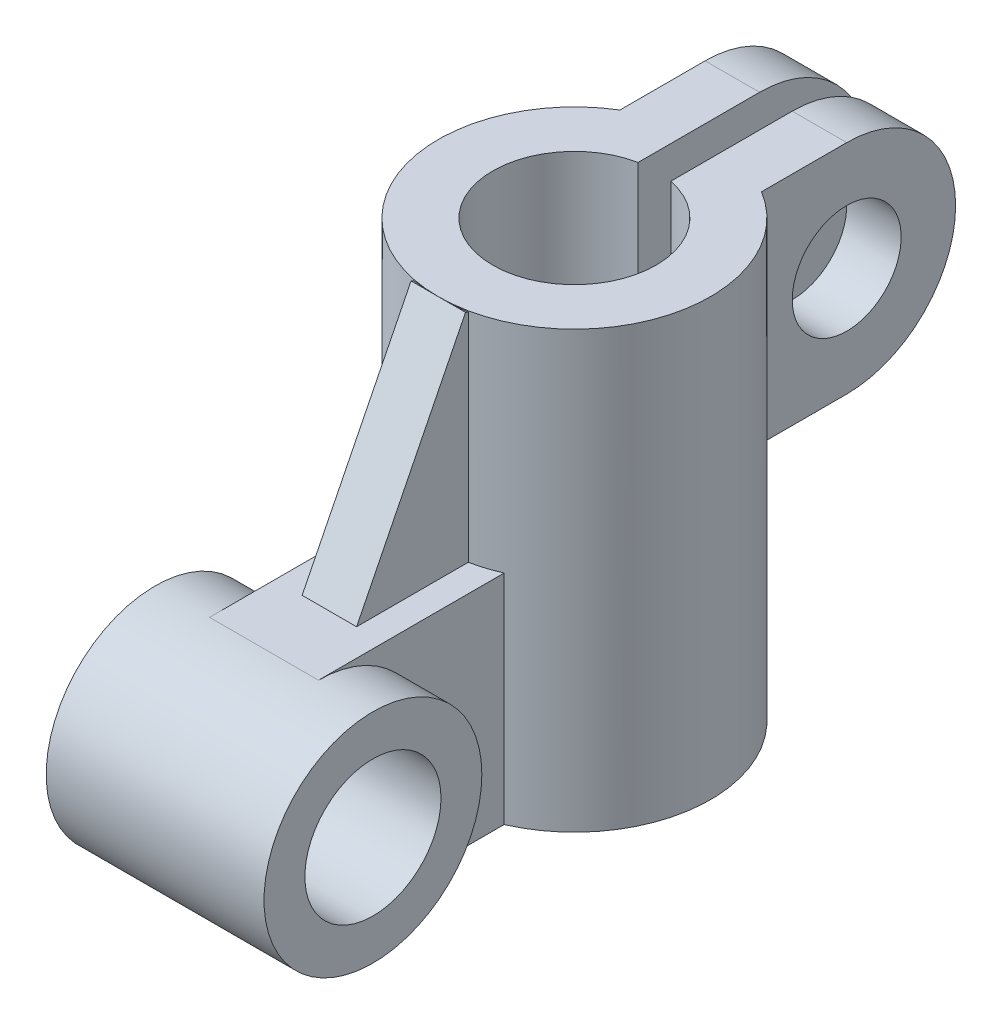
ISO-10303-21;
HEADER;
FILE_DESCRIPTION(('STEP AP214'),'2;1');
FILE_NAME('part.step','',(''),(''),'','','');
FILE_SCHEMA(('AUTOMOTIVE_DESIGN { 1 0 10303 214 1 1 1 1 }'));
ENDSEC;
DATA;
#1=APPLICATION_CONTEXT('core data for automotive mechanical design processes');
#2=APPLICATION_PROTOCOL_DEFINITION('international standard','automotive_design',2000,#1);
#3=PRODUCT_CONTEXT('',#1,'mechanical');
#4=PRODUCT('Part','Part','',(#3));
#5=PRODUCT_RELATED_PRODUCT_CATEGORY('part','',(#4));
#6=PRODUCT_DEFINITION_FORMATION('','',#4);
#7=PRODUCT_DEFINITION_CONTEXT('part definition',#1,'design');
#8=PRODUCT_DEFINITION('design','',#6,#7);
#9=PRODUCT_DEFINITION_SHAPE('','',#8);
#10=(LENGTH_UNIT() NAMED_UNIT(*) SI_UNIT(.MILLI.,.METRE.));
#11=(NAMED_UNIT(*) PLANE_ANGLE_UNIT() SI_UNIT($,.RADIAN.));
#12=(NAMED_UNIT(*) SI_UNIT($,.STERADIAN.) SOLID_ANGLE_UNIT());
#13=UNCERTAINTY_MEASURE_WITH_UNIT(LENGTH_MEASURE(1.E-05),#10,'distance_accuracy_value','');
#14=(GEOMETRIC_REPRESENTATION_CONTEXT(3) GLOBAL_UNCERTAINTY_ASSIGNED_CONTEXT((#13)) GLOBAL_UNIT_ASSIGNED_CONTEXT((#10,
#11,#12)) REPRESENTATION_CONTEXT('',''));
#15=CARTESIAN_POINT('',(0.,0.,0.));
#16=DIRECTION('',(0.,0.,1.));
#17=DIRECTION('',(1.,0.,0.));
#18=AXIS2_PLACEMENT_3D('',#15,#16,#17);
#19=CARTESIAN_POINT('',(0.,-40.,0.));
#20=DIRECTION('',(0.,1.,0.));
#21=DIRECTION('',(0.,0.,1.));
#22=AXIS2_PLACEMENT_3D('',#19,#20,#21);
#23=CYLINDRICAL_SURFACE('',#22,25.);
#24=DIRECTION('',(0.,1.,0.));
#25=VECTOR('',#24,1.);
#26=CARTESIAN_POINT('',(-5.,-40.,24.4948974278318));
#27=LINE('',#26,#25);
#28=CARTESIAN_POINT('',(-5.,0.,24.4948974278318));
#29=VERTEX_POINT('',#28);
#30=CARTESIAN_POINT('',(-5.,39.7747626807827,24.4948974278318));
#31=VERTEX_POINT('',#30);
#32=EDGE_CURVE('E64',#29,#31,#27,.T.);
#33=ORIENTED_EDGE('',*,*,#32,.T.);
#34=CARTESIAN_POINT('',(0.,28.8519019884211,0.));
#35=DIRECTION('',(0.,-0.913309368552247,0.407266494220548));
#36=DIRECTION('',(0.,0.407266494220548,0.913309368552247));
#37=AXIS2_PLACEMENT_3D('',#34,#35,#36);
#38=ELLIPSE('',#37,27.372981008209,25.);
#39=CARTESIAN_POINT('',(0.,40.,25.));
#40=VERTEX_POINT('',#39);
#41=EDGE_CURVE('E201',#31,#40,#38,.F.);
#42=ORIENTED_EDGE('',*,*,#41,.T.);
#43=CARTESIAN_POINT('',(0.,40.,0.));
#44=DIRECTION('',(0.,1.,0.));
#45=DIRECTION('',(0.,0.,1.));
#46=AXIS2_PLACEMENT_3D('',#43,#44,#45);
#47=CIRCLE('',#46,25.);
#48=CARTESIAN_POINT('',(-13.,40.,-21.3541565040626));
#49=VERTEX_POINT('',#48);
#50=EDGE_CURVE('E326',#49,#40,#47,.T.);
#51=ORIENTED_EDGE('',*,*,#50,.F.);
#52=DIRECTION('',(0.,1.,0.));
#53=VECTOR('',#52,1.);
#54=CARTESIAN_POINT('',(-13.,-40.,-21.3541565040626));
#55=LINE('',#54,#53);
#56=CARTESIAN_POINT('',(-13.,0.,-21.3541565040626));
#57=VERTEX_POINT('',#56);
#58=EDGE_CURVE('E309',#57,#49,#55,.T.);
#59=ORIENTED_EDGE('',*,*,#58,.F.);
#60=CARTESIAN_POINT('',(0.,0.,0.));
#61=DIRECTION('',(0.,1.,0.));
#62=DIRECTION('',(0.,0.,1.));
#63=AXIS2_PLACEMENT_3D('',#60,#61,#62);
#64=CIRCLE('',#63,25.);
#65=CARTESIAN_POINT('',(-3.,0.,-24.8193472919817));
#66=VERTEX_POINT('',#65);
#67=EDGE_CURVE('E312',#66,#57,#64,.T.);
#68=ORIENTED_EDGE('',*,*,#67,.F.);
#69=DIRECTION('',(0.,1.,0.));
#70=VECTOR('',#69,1.);
#71=CARTESIAN_POINT('',(-3.,-40.,-24.8193472919817));
#72=LINE('',#71,#70);
#73=CARTESIAN_POINT('',(-3.,-40.,-24.8193472919817));
#74=VERTEX_POINT('',#73);
#75=EDGE_CURVE('E263',#74,#66,#72,.T.);
#76=ORIENTED_EDGE('',*,*,#75,.F.);
#77=CARTESIAN_POINT('',(0.,-40.,0.));
#78=DIRECTION('',(0.,1.,0.));
#79=DIRECTION('',(0.,0.,1.));
#80=AXIS2_PLACEMENT_3D('',#77,#78,#79);
#81=CIRCLE('',#80,25.);
#82=CARTESIAN_POINT('',(-10.,-40.,22.9128784747792));
#83=VERTEX_POINT('',#82);
#84=EDGE_CURVE('E333',#74,#83,#81,.T.);
#85=ORIENTED_EDGE('',*,*,#84,.T.);
#86=DIRECTION('',(0.,1.,0.));
#87=VECTOR('',#86,1.);
#88=CARTESIAN_POINT('',(-10.,-40.,22.9128784747792));
#89=LINE('',#88,#87);
#90=CARTESIAN_POINT('',(-10.,0.,22.9128784747792));
#91=VERTEX_POINT('',#90);
#92=EDGE_CURVE('E235',#91,#83,#89,.F.);
#93=ORIENTED_EDGE('',*,*,#92,.F.);
#94=CARTESIAN_POINT('',(0.,0.,0.));
#95=DIRECTION('',(0.,-1.,0.));
#96=DIRECTION('',(0.,0.,-1.));
#97=AXIS2_PLACEMENT_3D('',#94,#95,#96);
#98=CIRCLE('',#97,25.);
#99=EDGE_CURVE('E238',#29,#91,#98,.T.);
#100=ORIENTED_EDGE('',*,*,#99,.F.);
#101=EDGE_LOOP('',(#33,#42,#51,#59,#68,#76,#85,#93,#100));
#102=FACE_BOUND('',#101,.T.);
#103=ADVANCED_FACE('F41',(#102),#23,.T.);
#104=DIRECTION('',(0.,1.,0.));
#105=VECTOR('',#104,1.);
#106=CARTESIAN_POINT('',(5.,-40.,24.4948974278318));
#107=LINE('',#106,#105);
#108=CARTESIAN_POINT('',(5.,0.,24.4948974278318));
#109=VERTEX_POINT('',#108);
#110=CARTESIAN_POINT('',(5.,39.7747626807827,24.4948974278318));
#111=VERTEX_POINT('',#110);
#112=EDGE_CURVE('E176',#109,#111,#107,.T.);
#113=ORIENTED_EDGE('',*,*,#112,.F.);
#114=CARTESIAN_POINT('',(10.,0.,22.9128784747792));
#115=VERTEX_POINT('',#114);
#116=EDGE_CURVE('E244',#115,#109,#98,.T.);
#117=ORIENTED_EDGE('',*,*,#116,.F.);
#118=DIRECTION('',(0.,1.,0.));
#119=VECTOR('',#118,1.);
#120=CARTESIAN_POINT('',(10.,-40.,22.9128784747792));
#121=LINE('',#120,#119);
#122=CARTESIAN_POINT('',(10.,-40.,22.9128784747792));
#123=VERTEX_POINT('',#122);
#124=EDGE_CURVE('E203',#123,#115,#121,.T.);
#125=ORIENTED_EDGE('',*,*,#124,.F.);
#126=CARTESIAN_POINT('',(3.,-40.,-24.8193472919817));
#127=VERTEX_POINT('',#126);
#128=EDGE_CURVE('E332',#123,#127,#81,.T.);
#129=ORIENTED_EDGE('',*,*,#128,.T.);
#130=DIRECTION('',(0.,1.,0.));
#131=VECTOR('',#130,1.);
#132=CARTESIAN_POINT('',(3.,-40.,-24.8193472919817));
#133=LINE('',#132,#131);
#134=CARTESIAN_POINT('',(3.,0.,-24.8193472919817));
#135=VERTEX_POINT('',#134);
#136=EDGE_CURVE('E275',#135,#127,#133,.F.);
#137=ORIENTED_EDGE('',*,*,#136,.F.);
#138=CARTESIAN_POINT('',(13.,0.,-21.3541565040626));
#139=VERTEX_POINT('',#138);
#140=EDGE_CURVE('E320',#139,#135,#64,.T.);
#141=ORIENTED_EDGE('',*,*,#140,.F.);
#142=DIRECTION('',(0.,1.,0.));
#143=VECTOR('',#142,1.);
#144=CARTESIAN_POINT('',(13.,-40.,-21.3541565040626));
#145=LINE('',#144,#143);
#146=CARTESIAN_POINT('',(13.,40.,-21.3541565040626));
#147=VERTEX_POINT('',#146);
#148=EDGE_CURVE('E281',#147,#139,#145,.F.);
#149=ORIENTED_EDGE('',*,*,#148,.F.);
#150=EDGE_CURVE('E325',#40,#147,#47,.T.);
#151=ORIENTED_EDGE('',*,*,#150,.F.);
#152=EDGE_CURVE('E56',#40,#111,#38,.F.);
#153=ORIENTED_EDGE('',*,*,#152,.T.);
#154=EDGE_LOOP('',(#113,#117,#125,#129,#137,#141,#149,#151,#153));
#155=FACE_BOUND('',#154,.T.);
#156=ADVANCED_FACE('F43',(#155),#23,.T.);
#157=CARTESIAN_POINT('',(-13.,0.,25.002));
#158=DIRECTION('',(0.,1.,0.));
#159=DIRECTION('',(0.,0.,1.));
#160=AXIS2_PLACEMENT_3D('',#157,#158,#159);
#161=PLANE('',#160);
#162=ORIENTED_EDGE('',*,*,#140,.T.);
#163=DIRECTION('',(0.,0.,-1.));
#164=VECTOR('',#163,1.);
#165=CARTESIAN_POINT('',(3.00000000000002,0.,25.002));
#166=LINE('',#165,#164);
#167=CARTESIAN_POINT('',(3.,0.,-37.));
#168=VERTEX_POINT('',#167);
#169=EDGE_CURVE('E272',#135,#168,#166,.T.);
#170=ORIENTED_EDGE('',*,*,#169,.T.);
#171=DIRECTION('',(-1.,0.,0.));
#172=VECTOR('',#171,1.);
#173=CARTESIAN_POINT('',(13.,0.,-37.));
#174=LINE('',#173,#172);
#175=CARTESIAN_POINT('',(13.,0.,-37.));
#176=VERTEX_POINT('',#175);
#177=EDGE_CURVE('E302',#176,#168,#174,.T.);
#178=ORIENTED_EDGE('',*,*,#177,.F.);
#179=DIRECTION('',(0.,0.,-1.));
#180=VECTOR('',#179,1.);
#181=CARTESIAN_POINT('',(13.,0.,-37.));
#182=LINE('',#181,#180);
#183=EDGE_CURVE('E297',#139,#176,#182,.T.);
#184=ORIENTED_EDGE('',*,*,#183,.F.);
#185=EDGE_LOOP('',(#162,#170,#178,#184));
#186=FACE_BOUND('',#185,.T.);
#187=ADVANCED_FACE('F384',(#186),#161,.F.);
#188=CARTESIAN_POINT('',(13.,20.,-37.));
#189=DIRECTION('',(-1.,0.,0.));
#190=DIRECTION('',(0.,0.,1.));
#191=AXIS2_PLACEMENT_3D('',#188,#189,#190);
#192=CYLINDRICAL_SURFACE('',#191,20.);
#193=ORIENTED_EDGE('',*,*,#177,.T.);
#194=CARTESIAN_POINT('',(3.,20.,-37.));
#195=DIRECTION('',(1.,0.,0.));
#196=DIRECTION('',(0.,0.,-1.));
#197=AXIS2_PLACEMENT_3D('',#194,#195,#196);
#198=CIRCLE('',#197,20.);
#199=CARTESIAN_POINT('',(2.99999999999999,40.,-37.));
#200=VERTEX_POINT('',#199);
#201=EDGE_CURVE('E269',#168,#200,#198,.T.);
#202=ORIENTED_EDGE('',*,*,#201,.T.);
#203=DIRECTION('',(-1.,0.,0.));
#204=VECTOR('',#203,1.);
#205=CARTESIAN_POINT('',(13.,40.,-37.));
#206=LINE('',#205,#204);
#207=CARTESIAN_POINT('',(13.,40.,-37.));
#208=VERTEX_POINT('',#207);
#209=EDGE_CURVE('E306',#208,#200,#206,.T.);
#210=ORIENTED_EDGE('',*,*,#209,.F.);
#211=CARTESIAN_POINT('',(13.,20.,-37.));
#212=DIRECTION('',(1.,0.,0.));
#213=DIRECTION('',(0.,0.,-1.));
#214=AXIS2_PLACEMENT_3D('',#211,#212,#213);
#215=CIRCLE('',#214,20.);
#216=EDGE_CURVE('E291',#176,#208,#215,.T.);
#217=ORIENTED_EDGE('',*,*,#216,.F.);
#218=EDGE_LOOP('',(#193,#202,#210,#217));
#219=FACE_BOUND('',#218,.T.);
#220=ADVANCED_FACE('F372',(#219),#192,.T.);
#221=CARTESIAN_POINT('',(13.,20.,-37.));
#222=DIRECTION('',(-1.,0.,0.));
#223=DIRECTION('',(0.,0.,1.));
#224=AXIS2_PLACEMENT_3D('',#221,#222,#223);
#225=CYLINDRICAL_SURFACE('',#224,10.);
#226=CARTESIAN_POINT('',(3.,20.,-37.));
#227=DIRECTION('',(1.,0.,0.));
#228=DIRECTION('',(0.,0.,-1.));
#229=AXIS2_PLACEMENT_3D('',#226,#227,#228);
#230=CIRCLE('',#229,10.);
#231=CARTESIAN_POINT('',(3.,20.,-27.));
#232=VERTEX_POINT('',#231);
#233=EDGE_CURVE('E268',#232,#232,#230,.T.);
#234=CARTESIAN_POINT('',(13.,20.,-37.));
#235=DIRECTION('',(1.,0.,0.));
#236=DIRECTION('',(0.,0.,-1.));
#237=AXIS2_PLACEMENT_3D('',#234,#235,#236);
#238=CIRCLE('',#237,10.);
#239=CARTESIAN_POINT('',(13.,20.,-27.));
#240=VERTEX_POINT('',#239);
#241=EDGE_CURVE('E285',#240,#240,#238,.T.);
#242=CARTESIAN_POINT('',(3.,20.,-27.));
#243=CARTESIAN_POINT('',(3.10416666666667,20.,-27.));
#244=CARTESIAN_POINT('',(3.20833333333333,20.,-27.));
#245=CARTESIAN_POINT('',(3.41666666666667,20.,-27.));
#246=CARTESIAN_POINT('',(3.52083333333333,20.,-27.));
#247=CARTESIAN_POINT('',(3.72916666666667,20.,-27.));
#248=CARTESIAN_POINT('',(3.83333333333333,20.,-27.));
#249=CARTESIAN_POINT('',(4.04166666666667,20.,-27.));
#250=CARTESIAN_POINT('',(4.14583333333333,20.,-27.));
#251=CARTESIAN_POINT('',(4.35416666666667,20.,-27.));
#252=CARTESIAN_POINT('',(4.45833333333333,20.,-27.));
#253=CARTESIAN_POINT('',(4.66666666666667,20.,-27.));
#254=CARTESIAN_POINT('',(4.77083333333333,20.,-27.));
#255=CARTESIAN_POINT('',(4.97916666666667,20.,-27.));
#256=CARTESIAN_POINT('',(5.08333333333333,20.,-27.));
#257=CARTESIAN_POINT('',(5.29166666666667,20.,-27.));
#258=CARTESIAN_POINT('',(5.39583333333333,20.,-27.));
#259=CARTESIAN_POINT('',(5.60416666666667,20.,-27.));
#260=CARTESIAN_POINT('',(5.70833333333333,20.,-27.));
#261=CARTESIAN_POINT('',(5.91666666666667,20.,-27.));
#262=CARTESIAN_POINT('',(6.02083333333333,20.,-27.));
#263=CARTESIAN_POINT('',(6.22916666666667,20.,-27.));
#264=CARTESIAN_POINT('',(6.33333333333333,20.,-27.));
#265=CARTESIAN_POINT('',(6.54166666666667,20.,-27.));
#266=CARTESIAN_POINT('',(6.64583333333333,20.,-27.));
#267=CARTESIAN_POINT('',(6.85416666666667,20.,-27.));
#268=CARTESIAN_POINT('',(6.95833333333333,20.,-27.));
#269=CARTESIAN_POINT('',(7.16666666666667,20.,-27.));
#270=CARTESIAN_POINT('',(7.27083333333333,20.,-27.));
#271=CARTESIAN_POINT('',(7.47916666666667,20.,-27.));
#272=CARTESIAN_POINT('',(7.58333333333333,20.,-27.));
#273=CARTESIAN_POINT('',(7.79166666666667,20.,-27.));
#274=CARTESIAN_POINT('',(7.89583333333333,20.,-27.));
#275=CARTESIAN_POINT('',(8.10416666666667,20.,-27.));
#276=CARTESIAN_POINT('',(8.20833333333333,20.,-27.));
#277=CARTESIAN_POINT('',(8.41666666666667,20.,-27.));
#278=CARTESIAN_POINT('',(8.52083333333333,20.,-27.));
#279=CARTESIAN_POINT('',(8.72916666666667,20.,-27.));
#280=CARTESIAN_POINT('',(8.83333333333333,20.,-27.));
#281=CARTESIAN_POINT('',(9.04166666666667,20.,-27.));
#282=CARTESIAN_POINT('',(9.14583333333333,20.,-27.));
#283=CARTESIAN_POINT('',(9.35416666666667,20.,-27.));
#284=CARTESIAN_POINT('',(9.45833333333333,20.,-27.));
#285=CARTESIAN_POINT('',(9.66666666666667,20.,-27.));
#286=CARTESIAN_POINT('',(9.77083333333333,20.,-27.));
#287=CARTESIAN_POINT('',(9.97916666666667,20.,-27.));
#288=CARTESIAN_POINT('',(10.0833333333333,20.,-27.));
#289=CARTESIAN_POINT('',(10.2916666666667,20.,-27.));
#290=CARTESIAN_POINT('',(10.3958333333333,20.,-27.));
#291=CARTESIAN_POINT('',(10.6041666666667,20.,-27.));
#292=CARTESIAN_POINT('',(10.7083333333333,20.,-27.));
#293=CARTESIAN_POINT('',(10.9166666666667,20.,-27.));
#294=CARTESIAN_POINT('',(11.0208333333333,20.,-27.));
#295=CARTESIAN_POINT('',(11.2291666666667,20.,-27.));
#296=CARTESIAN_POINT('',(11.3333333333333,20.,-27.));
#297=CARTESIAN_POINT('',(11.5416666666667,20.,-27.));
#298=CARTESIAN_POINT('',(11.6458333333333,20.,-27.));
#299=CARTESIAN_POINT('',(11.8541666666667,20.,-27.));
#300=CARTESIAN_POINT('',(11.9583333333333,20.,-27.));
#301=CARTESIAN_POINT('',(12.1666666666667,20.,-27.));
#302=CARTESIAN_POINT('',(12.2708333333333,20.,-27.));
#303=CARTESIAN_POINT('',(12.4791666666667,20.,-27.));
#304=CARTESIAN_POINT('',(12.5833333333333,20.,-27.));
#305=CARTESIAN_POINT('',(12.7916666666667,20.,-27.));
#306=CARTESIAN_POINT('',(12.8958333333333,20.,-27.));
#307=CARTESIAN_POINT('',(13.,20.,-27.));
#308=B_SPLINE_CURVE_WITH_KNOTS('',3,(#242,#243,#244,#245,#246,#247,#248,#249,#250,#251,#252,
#253,#254,#255,#256,#257,#258,#259,#260,#261,#262,#263,#264,#265,#266,#267,#268,#269,#270,#271,
#272,#273,#274,#275,#276,#277,#278,#279,#280,#281,#282,#283,#284,#285,#286,#287,#288,#289,#290,
#291,#292,#293,#294,#295,#296,#297,#298,#299,#300,#301,#302,#303,#304,#305,#306,#307),
.UNSPECIFIED.,.F.,.F.,(4,2,2,2,2,2,2,2,2,2,2,2,2,2,2,2,2,2,2,2,2,2,2,2,2,2,2,2,2,2,2,2,4),(0.,
0.3125,0.625000000000001,0.937500000000001,1.25,1.5625,1.875,2.1875,2.5,2.8125,3.125,3.4375,
3.75,4.0625,4.375,4.6875,5.,5.3125,5.625,5.9375,6.25,6.5625,6.875,7.1875,7.5,7.8125,8.125,
8.4375,8.75,9.0625,9.375,9.6875,10.),.UNSPECIFIED.);
#309=EDGE_CURVE('BSEAM379',#232,#240,#308,.T.);
#310=ORIENTED_EDGE('',*,*,#233,.F.);
#311=ORIENTED_EDGE('',*,*,#241,.T.);
#312=ORIENTED_EDGE('',*,*,#309,.T.);
#313=ORIENTED_EDGE('',*,*,#309,.F.);
#314=EDGE_LOOP('',(#310,#312,#311,#313));
#315=FACE_BOUND('',#314,.T.);
#316=ADVANCED_FACE('F379',(#315),#225,.F.);
#317=CARTESIAN_POINT('',(0.,-40.,0.));
#318=DIRECTION('',(0.,1.,0.));
#319=DIRECTION('',(0.,0.,1.));
#320=AXIS2_PLACEMENT_3D('',#317,#318,#319);
#321=PLANE('',#320);
#322=ORIENTED_EDGE('',*,*,#128,.F.);
#323=DIRECTION('',(0.,0.,1.));
#324=VECTOR('',#323,1.);
#325=CARTESIAN_POINT('',(10.,-40.,0.));
#326=LINE('',#325,#324);
#327=CARTESIAN_POINT('',(10.,-40.,57.));
#328=VERTEX_POINT('',#327);
#329=EDGE_CURVE('E221',#123,#328,#326,.T.);
#330=ORIENTED_EDGE('',*,*,#329,.T.);
#331=DIRECTION('',(-1.,0.,0.));
#332=VECTOR('',#331,1.);
#333=CARTESIAN_POINT('',(10.,-40.,57.));
#334=LINE('',#333,#332);
#335=CARTESIAN_POINT('',(-10.,-40.,57.));
#336=VERTEX_POINT('',#335);
#337=EDGE_CURVE('E232',#328,#336,#334,.T.);
#338=ORIENTED_EDGE('',*,*,#337,.T.);
#339=DIRECTION('',(0.,0.,1.));
#340=VECTOR('',#339,1.);
#341=CARTESIAN_POINT('',(-10.,-40.,-57.002));
#342=LINE('',#341,#340);
#343=EDGE_CURVE('E242',#83,#336,#342,.T.);
#344=ORIENTED_EDGE('',*,*,#343,.F.);
#345=ORIENTED_EDGE('',*,*,#84,.F.);
#346=DIRECTION('',(0.,0.,1.));
#347=VECTOR('',#346,1.);
#348=CARTESIAN_POINT('',(-3.00000000000004,-40.,-151.757178913158));
#349=LINE('',#348,#347);
#350=CARTESIAN_POINT('',(-3.,-40.,-14.6969384566991));
#351=VERTEX_POINT('',#350);
#352=EDGE_CURVE('E250',#74,#351,#349,.T.);
#353=ORIENTED_EDGE('',*,*,#352,.T.);
#354=CARTESIAN_POINT('',(0.,-40.,0.));
#355=DIRECTION('',(0.,1.,0.));
#356=DIRECTION('',(0.,0.,1.));
#357=AXIS2_PLACEMENT_3D('',#354,#355,#356);
#358=CIRCLE('',#357,15.);
#359=CARTESIAN_POINT('',(3.,-40.,-14.6969384566991));
#360=VERTEX_POINT('',#359);
#361=EDGE_CURVE('E329',#351,#360,#358,.T.);
#362=ORIENTED_EDGE('',*,*,#361,.T.);
#363=DIRECTION('',(0.,0.,-1.));
#364=VECTOR('',#363,1.);
#365=CARTESIAN_POINT('',(2.99999999999996,-40.,-151.757178913158));
#366=LINE('',#365,#364);
#367=EDGE_CURVE('E247',#360,#127,#366,.T.);
#368=ORIENTED_EDGE('',*,*,#367,.T.);
#369=EDGE_LOOP('',(#322,#330,#338,#344,#345,#353,#362,#368));
#370=FACE_BOUND('',#369,.T.);
#371=ADVANCED_FACE('F407',(#370),#321,.F.);
#372=CARTESIAN_POINT('',(0.,-40.,0.));
#373=DIRECTION('',(0.,1.,0.));
#374=DIRECTION('',(0.,0.,1.));
#375=AXIS2_PLACEMENT_3D('',#372,#373,#374);
#376=CYLINDRICAL_SURFACE('',#375,15.);
#377=CARTESIAN_POINT('',(0.,40.,0.));
#378=DIRECTION('',(0.,1.,0.));
#379=DIRECTION('',(0.,0.,1.));
#380=AXIS2_PLACEMENT_3D('',#377,#378,#379);
#381=CIRCLE('',#380,15.);
#382=CARTESIAN_POINT('',(-3.,40.,-14.6969384566991));
#383=VERTEX_POINT('',#382);
#384=CARTESIAN_POINT('',(3.,40.,-14.6969384566991));
#385=VERTEX_POINT('',#384);
#386=EDGE_CURVE('E316',#383,#385,#381,.T.);
#387=ORIENTED_EDGE('',*,*,#386,.T.);
#388=DIRECTION('',(0.,1.,0.));
#389=VECTOR('',#388,1.);
#390=CARTESIAN_POINT('',(3.,-40.,-14.6969384566991));
#391=LINE('',#390,#389);
#392=EDGE_CURVE('E278',#385,#360,#391,.F.);
#393=ORIENTED_EDGE('',*,*,#392,.T.);
#394=ORIENTED_EDGE('',*,*,#361,.F.);
#395=DIRECTION('',(0.,1.,0.));
#396=VECTOR('',#395,1.);
#397=CARTESIAN_POINT('',(-3.,-40.,-14.6969384566991));
#398=LINE('',#397,#396);
#399=EDGE_CURVE('E265',#351,#383,#398,.T.);
#400=ORIENTED_EDGE('',*,*,#399,.T.);
#401=EDGE_LOOP('',(#387,#393,#394,#400));
#402=FACE_BOUND('',#401,.T.);
#403=ADVANCED_FACE('F403',(#402),#376,.F.);
#404=CARTESIAN_POINT('',(0.,40.,0.));
#405=DIRECTION('',(0.,1.,0.));
#406=DIRECTION('',(0.,0.,1.));
#407=AXIS2_PLACEMENT_3D('',#404,#405,#406);
#408=PLANE('',#407);
#409=DIRECTION('',(0.,0.,-1.));
#410=VECTOR('',#409,1.);
#411=CARTESIAN_POINT('',(2.99999999999996,40.,-151.757178913158));
#412=LINE('',#411,#410);
#413=EDGE_CURVE('E241',#385,#200,#412,.T.);
#414=ORIENTED_EDGE('',*,*,#413,.F.);
#415=ORIENTED_EDGE('',*,*,#386,.F.);
#416=DIRECTION('',(0.,0.,1.));
#417=VECTOR('',#416,1.);
#418=CARTESIAN_POINT('',(-3.00000000000004,40.,-151.757178913158));
#419=LINE('',#418,#417);
#420=CARTESIAN_POINT('',(-3.,40.,-37.));
#421=VERTEX_POINT('',#420);
#422=EDGE_CURVE('E251',#421,#383,#419,.T.);
#423=ORIENTED_EDGE('',*,*,#422,.F.);
#424=CARTESIAN_POINT('',(-13.,40.,-37.));
#425=VERTEX_POINT('',#424);
#426=EDGE_CURVE('E305',#421,#425,#206,.T.);
#427=ORIENTED_EDGE('',*,*,#426,.T.);
#428=DIRECTION('',(0.,0.,-1.));
#429=VECTOR('',#428,1.);
#430=CARTESIAN_POINT('',(-13.,40.,25.002));
#431=LINE('',#430,#429);
#432=EDGE_CURVE('E317',#49,#425,#431,.T.);
#433=ORIENTED_EDGE('',*,*,#432,.F.);
#434=ORIENTED_EDGE('',*,*,#50,.T.);
#435=ORIENTED_EDGE('',*,*,#150,.T.);
#436=DIRECTION('',(0.,0.,1.));
#437=VECTOR('',#436,1.);
#438=CARTESIAN_POINT('',(13.,40.,-37.));
#439=LINE('',#438,#437);
#440=EDGE_CURVE('E294',#208,#147,#439,.T.);
#441=ORIENTED_EDGE('',*,*,#440,.F.);
#442=ORIENTED_EDGE('',*,*,#209,.T.);
#443=EDGE_LOOP('',(#414,#415,#423,#427,#433,#434,#435,#441,#442));
#444=FACE_BOUND('',#443,.T.);
#445=ADVANCED_FACE('F350',(#444),#408,.T.);
#446=CARTESIAN_POINT('',(-13.,40.,25.002));
#447=DIRECTION('',(1.,0.,0.));
#448=DIRECTION('',(0.,0.,-1.));
#449=AXIS2_PLACEMENT_3D('',#446,#447,#448);
#450=PLANE('',#449);
#451=DIRECTION('',(0.,0.,-1.));
#452=VECTOR('',#451,1.);
#453=CARTESIAN_POINT('',(-13.,0.,25.002));
#454=LINE('',#453,#452);
#455=CARTESIAN_POINT('',(-13.,0.,-37.));
#456=VERTEX_POINT('',#455);
#457=EDGE_CURVE('E313',#57,#456,#454,.T.);
#458=ORIENTED_EDGE('',*,*,#457,.F.);
#459=ORIENTED_EDGE('',*,*,#58,.T.);
#460=ORIENTED_EDGE('',*,*,#432,.T.);
#461=CARTESIAN_POINT('',(-13.,20.,-37.));
#462=DIRECTION('',(1.,0.,0.));
#463=DIRECTION('',(0.,0.,-1.));
#464=AXIS2_PLACEMENT_3D('',#461,#462,#463);
#465=CIRCLE('',#464,20.);
#466=EDGE_CURVE('E288',#456,#425,#465,.T.);
#467=ORIENTED_EDGE('',*,*,#466,.F.);
#468=EDGE_LOOP('',(#458,#459,#460,#467));
#469=FACE_BOUND('',#468,.T.);
#470=CARTESIAN_POINT('',(-13.,20.,-37.));
#471=DIRECTION('',(1.,0.,0.));
#472=DIRECTION('',(0.,0.,-1.));
#473=AXIS2_PLACEMENT_3D('',#470,#471,#472);
#474=CIRCLE('',#473,10.);
#475=CARTESIAN_POINT('',(-13.,20.,-27.));
#476=VERTEX_POINT('',#475);
#477=EDGE_CURVE('E284',#476,#476,#474,.T.);
#478=ORIENTED_EDGE('',*,*,#477,.T.);
#479=EDGE_LOOP('',(#478));
#480=FACE_BOUND('',#479,.T.);
#481=ADVANCED_FACE('F356',(#469,#480),#450,.F.);
#482=CARTESIAN_POINT('',(-2.99999999999999,0.,-37.));
#483=VERTEX_POINT('',#482);
#484=EDGE_CURVE('E299',#483,#456,#174,.T.);
#485=ORIENTED_EDGE('',*,*,#484,.F.);
#486=DIRECTION('',(0.,0.,1.));
#487=VECTOR('',#486,1.);
#488=CARTESIAN_POINT('',(-2.99999999999998,0.,25.002));
#489=LINE('',#488,#487);
#490=EDGE_CURVE('E260',#483,#66,#489,.T.);
#491=ORIENTED_EDGE('',*,*,#490,.T.);
#492=ORIENTED_EDGE('',*,*,#67,.T.);
#493=ORIENTED_EDGE('',*,*,#457,.T.);
#494=EDGE_LOOP('',(#485,#491,#492,#493));
#495=FACE_BOUND('',#494,.T.);
#496=ADVANCED_FACE('F363',(#495),#161,.F.);
#497=CARTESIAN_POINT('',(13.,20.,-37.));
#498=DIRECTION('',(1.,0.,0.));
#499=DIRECTION('',(0.,0.,-1.));
#500=AXIS2_PLACEMENT_3D('',#497,#498,#499);
#501=PLANE('',#500);
#502=ORIENTED_EDGE('',*,*,#216,.T.);
#503=ORIENTED_EDGE('',*,*,#440,.T.);
#504=ORIENTED_EDGE('',*,*,#148,.T.);
#505=ORIENTED_EDGE('',*,*,#183,.T.);
#506=EDGE_LOOP('',(#502,#503,#504,#505));
#507=FACE_BOUND('',#506,.T.);
#508=ORIENTED_EDGE('',*,*,#241,.F.);
#509=EDGE_LOOP('',(#508));
#510=FACE_BOUND('',#509,.T.);
#511=ADVANCED_FACE('F370',(#507,#510),#501,.T.);
#512=ORIENTED_EDGE('',*,*,#426,.F.);
#513=CARTESIAN_POINT('',(-3.,20.,-37.));
#514=DIRECTION('',(-1.,0.,0.));
#515=DIRECTION('',(0.,0.,1.));
#516=AXIS2_PLACEMENT_3D('',#513,#514,#515);
#517=CIRCLE('',#516,20.);
#518=EDGE_CURVE('E257',#421,#483,#517,.T.);
#519=ORIENTED_EDGE('',*,*,#518,.T.);
#520=ORIENTED_EDGE('',*,*,#484,.T.);
#521=ORIENTED_EDGE('',*,*,#466,.T.);
#522=EDGE_LOOP('',(#512,#519,#520,#521));
#523=FACE_BOUND('',#522,.T.);
#524=ADVANCED_FACE('F367',(#523),#192,.T.);
#525=CARTESIAN_POINT('',(-3.,20.,-37.));
#526=DIRECTION('',(-1.,0.,0.));
#527=DIRECTION('',(0.,0.,1.));
#528=AXIS2_PLACEMENT_3D('',#525,#526,#527);
#529=CIRCLE('',#528,10.);
#530=CARTESIAN_POINT('',(-3.,20.,-27.));
#531=VERTEX_POINT('',#530);
#532=EDGE_CURVE('E254',#531,#531,#529,.T.);
#533=CARTESIAN_POINT('',(-3.,20.,-27.));
#534=CARTESIAN_POINT('',(-3.10416666666667,20.,-27.));
#535=CARTESIAN_POINT('',(-3.20833333333334,20.,-27.));
#536=CARTESIAN_POINT('',(-3.41666666666667,20.,-27.));
#537=CARTESIAN_POINT('',(-3.52083333333334,20.,-27.));
#538=CARTESIAN_POINT('',(-3.72916666666667,20.,-27.));
#539=CARTESIAN_POINT('',(-3.83333333333334,20.,-27.));
#540=CARTESIAN_POINT('',(-4.04166666666667,20.,-27.));
#541=CARTESIAN_POINT('',(-4.14583333333334,20.,-27.));
#542=CARTESIAN_POINT('',(-4.35416666666667,20.,-27.));
#543=CARTESIAN_POINT('',(-4.45833333333334,20.,-27.));
#544=CARTESIAN_POINT('',(-4.66666666666667,20.,-27.));
#545=CARTESIAN_POINT('',(-4.77083333333334,20.,-27.));
#546=CARTESIAN_POINT('',(-4.97916666666667,20.,-27.));
#547=CARTESIAN_POINT('',(-5.08333333333334,20.,-27.));
#548=CARTESIAN_POINT('',(-5.29166666666667,20.,-27.));
#549=CARTESIAN_POINT('',(-5.39583333333334,20.,-27.));
#550=CARTESIAN_POINT('',(-5.60416666666667,20.,-27.));
#551=CARTESIAN_POINT('',(-5.70833333333334,20.,-27.));
#552=CARTESIAN_POINT('',(-5.91666666666667,20.,-27.));
#553=CARTESIAN_POINT('',(-6.02083333333334,20.,-27.));
#554=CARTESIAN_POINT('',(-6.22916666666667,20.,-27.));
#555=CARTESIAN_POINT('',(-6.33333333333334,20.,-27.));
#556=CARTESIAN_POINT('',(-6.54166666666667,20.,-27.));
#557=CARTESIAN_POINT('',(-6.64583333333333,20.,-27.));
#558=CARTESIAN_POINT('',(-6.85416666666667,20.,-27.));
#559=CARTESIAN_POINT('',(-6.95833333333333,20.,-27.));
#560=CARTESIAN_POINT('',(-7.16666666666667,20.,-27.));
#561=CARTESIAN_POINT('',(-7.27083333333333,20.,-27.));
#562=CARTESIAN_POINT('',(-7.47916666666667,20.,-27.));
#563=CARTESIAN_POINT('',(-7.58333333333333,20.,-27.));
#564=CARTESIAN_POINT('',(-7.79166666666667,20.,-27.));
#565=CARTESIAN_POINT('',(-7.89583333333333,20.,-27.));
#566=CARTESIAN_POINT('',(-8.10416666666667,20.,-27.));
#567=CARTESIAN_POINT('',(-8.20833333333334,20.,-27.));
#568=CARTESIAN_POINT('',(-8.41666666666667,20.,-27.));
#569=CARTESIAN_POINT('',(-8.52083333333334,20.,-27.));
#570=CARTESIAN_POINT('',(-8.72916666666667,20.,-27.));
#571=CARTESIAN_POINT('',(-8.83333333333334,20.,-27.));
#572=CARTESIAN_POINT('',(-9.04166666666667,20.,-27.));
#573=CARTESIAN_POINT('',(-9.14583333333334,20.,-27.));
#574=CARTESIAN_POINT('',(-9.35416666666667,20.,-27.));
#575=CARTESIAN_POINT('',(-9.45833333333334,20.,-27.));
#576=CARTESIAN_POINT('',(-9.66666666666667,20.,-27.));
#577=CARTESIAN_POINT('',(-9.77083333333333,20.,-27.));
#578=CARTESIAN_POINT('',(-9.97916666666667,20.,-27.));
#579=CARTESIAN_POINT('',(-10.0833333333333,20.,-27.));
#580=CARTESIAN_POINT('',(-10.2916666666667,20.,-27.));
#581=CARTESIAN_POINT('',(-10.3958333333333,20.,-27.));
#582=CARTESIAN_POINT('',(-10.6041666666667,20.,-27.));
#583=CARTESIAN_POINT('',(-10.7083333333333,20.,-27.));
#584=CARTESIAN_POINT('',(-10.9166666666667,20.,-27.));
#585=CARTESIAN_POINT('',(-11.0208333333333,20.,-27.));
#586=CARTESIAN_POINT('',(-11.2291666666667,20.,-27.));
#587=CARTESIAN_POINT('',(-11.3333333333333,20.,-27.));
#588=CARTESIAN_POINT('',(-11.5416666666667,20.,-27.));
#589=CARTESIAN_POINT('',(-11.6458333333333,20.,-27.));
#590=CARTESIAN_POINT('',(-11.8541666666667,20.,-27.));
#591=CARTESIAN_POINT('',(-11.9583333333333,20.,-27.));
#592=CARTESIAN_POINT('',(-12.1666666666667,20.,-27.));
#593=CARTESIAN_POINT('',(-12.2708333333333,20.,-27.));
#594=CARTESIAN_POINT('',(-12.4791666666667,20.,-27.));
#595=CARTESIAN_POINT('',(-12.5833333333333,20.,-27.));
#596=CARTESIAN_POINT('',(-12.7916666666667,20.,-27.));
#597=CARTESIAN_POINT('',(-12.8958333333333,20.,-27.));
#598=CARTESIAN_POINT('',(-13.,20.,-27.));
#599=B_SPLINE_CURVE_WITH_KNOTS('',3,(#533,#534,#535,#536,#537,#538,#539,#540,#541,#542,#543,
#544,#545,#546,#547,#548,#549,#550,#551,#552,#553,#554,#555,#556,#557,#558,#559,#560,#561,#562,
#563,#564,#565,#566,#567,#568,#569,#570,#571,#572,#573,#574,#575,#576,#577,#578,#579,#580,#581,
#582,#583,#584,#585,#586,#587,#588,#589,#590,#591,#592,#593,#594,#595,#596,#597,#598),
.UNSPECIFIED.,.F.,.F.,(4,2,2,2,2,2,2,2,2,2,2,2,2,2,2,2,2,2,2,2,2,2,2,2,2,2,2,2,2,2,2,2,4),(0.,
0.3125,0.625000000000001,0.937500000000001,1.25,1.5625,1.875,2.1875,2.5,2.8125,3.125,3.4375,
3.75,4.0625,4.375,4.6875,5.,5.3125,5.625,5.9375,6.25,6.5625,6.875,7.1875,7.5,7.8125,8.125,
8.43749999999999,8.74999999999999,9.06249999999999,9.37499999999999,9.68749999999999,
9.99999999999999),.UNSPECIFIED.);
#600=EDGE_CURVE('BSEAM369',#531,#476,#599,.T.);
#601=ORIENTED_EDGE('',*,*,#532,.F.);
#602=ORIENTED_EDGE('',*,*,#477,.F.);
#603=ORIENTED_EDGE('',*,*,#600,.T.);
#604=ORIENTED_EDGE('',*,*,#600,.F.);
#605=EDGE_LOOP('',(#601,#603,#602,#604));
#606=FACE_BOUND('',#605,.T.);
#607=ADVANCED_FACE('F369',(#606),#225,.F.);
#608=CARTESIAN_POINT('',(-3.00000000000004,-40.,-151.757178913158));
#609=DIRECTION('',(-1.,0.,0.));
#610=DIRECTION('',(0.,0.,1.));
#611=AXIS2_PLACEMENT_3D('',#608,#609,#610);
#612=PLANE('',#611);
#613=ORIENTED_EDGE('',*,*,#532,.T.);
#614=EDGE_LOOP('',(#613));
#615=FACE_BOUND('',#614,.T.);
#616=ORIENTED_EDGE('',*,*,#352,.F.);
#617=ORIENTED_EDGE('',*,*,#75,.T.);
#618=ORIENTED_EDGE('',*,*,#490,.F.);
#619=ORIENTED_EDGE('',*,*,#518,.F.);
#620=ORIENTED_EDGE('',*,*,#422,.T.);
#621=ORIENTED_EDGE('',*,*,#399,.F.);
#622=EDGE_LOOP('',(#616,#617,#618,#619,#620,#621));
#623=FACE_BOUND('',#622,.T.);
#624=ADVANCED_FACE('F365',(#615,#623),#612,.F.);
#625=CARTESIAN_POINT('',(2.99999999999996,-40.,-151.757178913158));
#626=DIRECTION('',(1.,0.,0.));
#627=DIRECTION('',(0.,0.,-1.));
#628=AXIS2_PLACEMENT_3D('',#625,#626,#627);
#629=PLANE('',#628);
#630=ORIENTED_EDGE('',*,*,#233,.T.);
#631=EDGE_LOOP('',(#630));
#632=FACE_BOUND('',#631,.T.);
#633=ORIENTED_EDGE('',*,*,#413,.T.);
#634=ORIENTED_EDGE('',*,*,#201,.F.);
#635=ORIENTED_EDGE('',*,*,#169,.F.);
#636=ORIENTED_EDGE('',*,*,#136,.T.);
#637=ORIENTED_EDGE('',*,*,#367,.F.);
#638=ORIENTED_EDGE('',*,*,#392,.F.);
#639=EDGE_LOOP('',(#633,#634,#635,#636,#637,#638));
#640=FACE_BOUND('',#639,.T.);
#641=ADVANCED_FACE('F420',(#632,#640),#629,.F.);
#642=CARTESIAN_POINT('',(-10.,-40.,-57.002));
#643=DIRECTION('',(1.,0.,0.));
#644=DIRECTION('',(0.,0.,-1.));
#645=AXIS2_PLACEMENT_3D('',#642,#643,#644);
#646=PLANE('',#645);
#647=DIRECTION('',(0.,0.,1.));
#648=VECTOR('',#647,1.);
#649=CARTESIAN_POINT('',(-10.,0.,-57.002));
#650=LINE('',#649,#648);
#651=CARTESIAN_POINT('',(-10.,0.,57.));
#652=VERTEX_POINT('',#651);
#653=EDGE_CURVE('E239',#91,#652,#650,.T.);
#654=ORIENTED_EDGE('',*,*,#653,.F.);
#655=ORIENTED_EDGE('',*,*,#92,.T.);
#656=ORIENTED_EDGE('',*,*,#343,.T.);
#657=CARTESIAN_POINT('',(-10.,-20.,57.));
#658=DIRECTION('',(1.,0.,0.));
#659=DIRECTION('',(0.,0.,-1.));
#660=AXIS2_PLACEMENT_3D('',#657,#658,#659);
#661=CIRCLE('',#660,20.);
#662=EDGE_CURVE('E216',#336,#652,#661,.T.);
#663=ORIENTED_EDGE('',*,*,#662,.T.);
#664=EDGE_LOOP('',(#654,#655,#656,#663));
#665=FACE_BOUND('',#664,.T.);
#666=ADVANCED_FACE('F432',(#665),#646,.F.);
#667=CARTESIAN_POINT('',(-10.,0.,-57.002));
#668=DIRECTION('',(0.,-1.,0.));
#669=DIRECTION('',(0.,0.,-1.));
#670=AXIS2_PLACEMENT_3D('',#667,#668,#669);
#671=PLANE('',#670);
#672=ORIENTED_EDGE('',*,*,#116,.T.);
#673=DIRECTION('',(0.,0.,1.));
#674=VECTOR('',#673,1.);
#675=CARTESIAN_POINT('',(5.,0.,-57.002));
#676=LINE('',#675,#674);
#677=CARTESIAN_POINT('',(5.,0.,45.));
#678=VERTEX_POINT('',#677);
#679=EDGE_CURVE('E12',#109,#678,#676,.T.);
#680=ORIENTED_EDGE('',*,*,#679,.T.);
#681=DIRECTION('',(-1.,0.,0.));
#682=VECTOR('',#681,1.);
#683=CARTESIAN_POINT('',(5.,0.,45.));
#684=LINE('',#683,#682);
#685=CARTESIAN_POINT('',(-5.,0.,45.));
#686=VERTEX_POINT('',#685);
#687=EDGE_CURVE('E190',#678,#686,#684,.T.);
#688=ORIENTED_EDGE('',*,*,#687,.T.);
#689=DIRECTION('',(0.,0.,1.));
#690=VECTOR('',#689,1.);
#691=CARTESIAN_POINT('',(-5.,0.,-57.002));
#692=LINE('',#691,#690);
#693=EDGE_CURVE('E49',#29,#686,#692,.T.);
#694=ORIENTED_EDGE('',*,*,#693,.F.);
#695=ORIENTED_EDGE('',*,*,#99,.T.);
#696=ORIENTED_EDGE('',*,*,#653,.T.);
#697=DIRECTION('',(-1.,0.,0.));
#698=VECTOR('',#697,1.);
#699=CARTESIAN_POINT('',(10.,0.,57.));
#700=LINE('',#699,#698);
#701=CARTESIAN_POINT('',(10.,0.,57.));
#702=VERTEX_POINT('',#701);
#703=EDGE_CURVE('E227',#702,#652,#700,.T.);
#704=ORIENTED_EDGE('',*,*,#703,.F.);
#705=DIRECTION('',(0.,0.,1.));
#706=VECTOR('',#705,1.);
#707=CARTESIAN_POINT('',(10.,0.,0.));
#708=LINE('',#707,#706);
#709=EDGE_CURVE('E224',#115,#702,#708,.T.);
#710=ORIENTED_EDGE('',*,*,#709,.F.);
#711=EDGE_LOOP('',(#672,#680,#688,#694,#695,#696,#704,#710));
#712=FACE_BOUND('',#711,.T.);
#713=ADVANCED_FACE('F435',(#712),#671,.F.);
#714=CARTESIAN_POINT('',(10.,0.,0.));
#715=DIRECTION('',(1.,0.,0.));
#716=DIRECTION('',(0.,0.,-1.));
#717=AXIS2_PLACEMENT_3D('',#714,#715,#716);
#718=PLANE('',#717);
#719=CARTESIAN_POINT('',(10.,-20.,57.));
#720=DIRECTION('',(1.,0.,0.));
#721=DIRECTION('',(0.,0.,-1.));
#722=AXIS2_PLACEMENT_3D('',#719,#720,#721);
#723=CIRCLE('',#722,20.);
#724=EDGE_CURVE('E219',#328,#702,#723,.T.);
#725=ORIENTED_EDGE('',*,*,#724,.F.);
#726=ORIENTED_EDGE('',*,*,#329,.F.);
#727=ORIENTED_EDGE('',*,*,#124,.T.);
#728=ORIENTED_EDGE('',*,*,#709,.T.);
#729=EDGE_LOOP('',(#725,#726,#727,#728));
#730=FACE_BOUND('',#729,.T.);
#731=ADVANCED_FACE('F442',(#730),#718,.T.);
#732=CARTESIAN_POINT('',(20.,-20.,57.));
#733=DIRECTION('',(1.,0.,0.));
#734=DIRECTION('',(0.,0.,-1.));
#735=AXIS2_PLACEMENT_3D('',#732,#733,#734);
#736=PLANE('',#735);
#737=CARTESIAN_POINT('',(20.,-20.,57.));
#738=DIRECTION('',(1.,0.,0.));
#739=DIRECTION('',(0.,0.,-1.));
#740=AXIS2_PLACEMENT_3D('',#737,#738,#739);
#741=CIRCLE('',#740,20.);
#742=CARTESIAN_POINT('',(20.,-20.,37.));
#743=VERTEX_POINT('',#742);
#744=EDGE_CURVE('E213',#743,#743,#741,.T.);
#745=ORIENTED_EDGE('',*,*,#744,.T.);
#746=EDGE_LOOP('',(#745));
#747=FACE_BOUND('',#746,.T.);
#748=CARTESIAN_POINT('',(20.,-20.,57.));
#749=DIRECTION('',(1.,0.,0.));
#750=DIRECTION('',(0.,0.,-1.));
#751=AXIS2_PLACEMENT_3D('',#748,#749,#750);
#752=CIRCLE('',#751,12.5);
#753=CARTESIAN_POINT('',(20.,-20.,44.5));
#754=VERTEX_POINT('',#753);
#755=EDGE_CURVE('E207',#754,#754,#752,.T.);
#756=ORIENTED_EDGE('',*,*,#755,.F.);
#757=EDGE_LOOP('',(#756));
#758=FACE_BOUND('',#757,.T.);
#759=ADVANCED_FACE('F444',(#747,#758),#736,.T.);
#760=CARTESIAN_POINT('',(-20.,-20.,57.));
#761=DIRECTION('',(1.,0.,0.));
#762=DIRECTION('',(0.,0.,-1.));
#763=AXIS2_PLACEMENT_3D('',#760,#761,#762);
#764=PLANE('',#763);
#765=CARTESIAN_POINT('',(-20.,-20.,57.));
#766=DIRECTION('',(1.,0.,0.));
#767=DIRECTION('',(0.,0.,-1.));
#768=AXIS2_PLACEMENT_3D('',#765,#766,#767);
#769=CIRCLE('',#768,20.);
#770=CARTESIAN_POINT('',(-20.,-20.,37.));
#771=VERTEX_POINT('',#770);
#772=EDGE_CURVE('E210',#771,#771,#769,.T.);
#773=ORIENTED_EDGE('',*,*,#772,.F.);
#774=EDGE_LOOP('',(#773));
#775=FACE_BOUND('',#774,.T.);
#776=CARTESIAN_POINT('',(-20.,-20.,57.));
#777=DIRECTION('',(1.,0.,0.));
#778=DIRECTION('',(0.,0.,-1.));
#779=AXIS2_PLACEMENT_3D('',#776,#777,#778);
#780=CIRCLE('',#779,12.5);
#781=CARTESIAN_POINT('',(-20.,-20.,44.5));
#782=VERTEX_POINT('',#781);
#783=EDGE_CURVE('E206',#782,#782,#780,.T.);
#784=ORIENTED_EDGE('',*,*,#783,.T.);
#785=EDGE_LOOP('',(#784));
#786=FACE_BOUND('',#785,.T.);
#787=ADVANCED_FACE('F450',(#775,#786),#764,.F.);
#788=CARTESIAN_POINT('',(20.,-20.,57.));
#789=DIRECTION('',(-1.,0.,0.));
#790=DIRECTION('',(0.,0.,1.));
#791=AXIS2_PLACEMENT_3D('',#788,#789,#790);
#792=CYLINDRICAL_SURFACE('',#791,20.);
#793=ORIENTED_EDGE('',*,*,#724,.T.);
#794=ORIENTED_EDGE('',*,*,#703,.T.);
#795=ORIENTED_EDGE('',*,*,#662,.F.);
#796=ORIENTED_EDGE('',*,*,#337,.F.);
#797=EDGE_LOOP('',(#793,#794,#795,#796));
#798=FACE_BOUND('',#797,.T.);
#799=ORIENTED_EDGE('',*,*,#744,.F.);
#800=EDGE_LOOP('',(#799));
#801=FACE_BOUND('',#800,.T.);
#802=ORIENTED_EDGE('',*,*,#772,.T.);
#803=EDGE_LOOP('',(#802));
#804=FACE_BOUND('',#803,.T.);
#805=ADVANCED_FACE('F438',(#798,#801,#804),#792,.T.);
#806=CARTESIAN_POINT('',(20.,-20.,57.));
#807=DIRECTION('',(-1.,0.,0.));
#808=DIRECTION('',(0.,0.,1.));
#809=AXIS2_PLACEMENT_3D('',#806,#807,#808);
#810=CYLINDRICAL_SURFACE('',#809,12.5);
#811=ORIENTED_EDGE('',*,*,#755,.T.);
#812=EDGE_LOOP('',(#811));
#813=FACE_BOUND('',#812,.T.);
#814=ORIENTED_EDGE('',*,*,#783,.F.);
#815=EDGE_LOOP('',(#814));
#816=FACE_BOUND('',#815,.T.);
#817=ADVANCED_FACE('F518',(#813,#816),#810,.F.);
#818=CARTESIAN_POINT('',(5.,24.0663524906858,-10.7317622538949));
#819=DIRECTION('',(0.,-0.913309368552247,0.407266494220548));
#820=DIRECTION('',(0.,-0.407266494220548,-0.913309368552247));
#821=AXIS2_PLACEMENT_3D('',#818,#819,#820);
#822=PLANE('',#821);
#823=ORIENTED_EDGE('',*,*,#152,.F.);
#824=DIRECTION('',(-1.,0.,0.));
#825=VECTOR('',#824,1.);
#826=CARTESIAN_POINT('',(5.,40.,25.));
#827=LINE('',#826,#825);
#828=CARTESIAN_POINT('',(5.,40.,25.));
#829=VERTEX_POINT('',#828);
#830=EDGE_CURVE('E181',#829,#40,#827,.T.);
#831=ORIENTED_EDGE('',*,*,#830,.F.);
#832=DIRECTION('',(0.,0.407266494220548,0.913309368552247));
#833=VECTOR('',#832,1.);
#834=CARTESIAN_POINT('',(5.,24.0663524906858,-10.7317622538949));
#835=LINE('',#834,#833);
#836=EDGE_CURVE('E170',#111,#829,#835,.T.);
#837=ORIENTED_EDGE('',*,*,#836,.F.);
#838=EDGE_LOOP('',(#823,#831,#837));
#839=FACE_BOUND('',#838,.T.);
#840=ADVANCED_FACE('F182',(#839),#822,.F.);
#841=ORIENTED_EDGE('',*,*,#41,.F.);
#842=DIRECTION('',(0.,0.407266494220548,0.913309368552247));
#843=VECTOR('',#842,1.);
#844=CARTESIAN_POINT('',(-5.,24.0663524906858,-10.7317622538949));
#845=LINE('',#844,#843);
#846=CARTESIAN_POINT('',(-5.,40.,25.));
#847=VERTEX_POINT('',#846);
#848=EDGE_CURVE('E194',#31,#847,#845,.T.);
#849=ORIENTED_EDGE('',*,*,#848,.T.);
#850=EDGE_CURVE('E185',#40,#847,#827,.T.);
#851=ORIENTED_EDGE('',*,*,#850,.F.);
#852=EDGE_LOOP('',(#841,#849,#851));
#853=FACE_BOUND('',#852,.T.);
#854=ADVANCED_FACE('F344',(#853),#822,.F.);
#855=CARTESIAN_POINT('',(5.,18.,36.));
#856=DIRECTION('',(0.,0.447213595499958,0.894427190999916));
#857=DIRECTION('',(0.,-0.894427190999916,0.447213595499958));
#858=AXIS2_PLACEMENT_3D('',#855,#856,#857);
#859=PLANE('',#858);
#860=DIRECTION('',(0.,0.894427190999916,-0.447213595499958));
#861=VECTOR('',#860,1.);
#862=CARTESIAN_POINT('',(-5.,18.,36.));
#863=LINE('',#862,#861);
#864=EDGE_CURVE('E178',#686,#847,#863,.T.);
#865=ORIENTED_EDGE('',*,*,#864,.F.);
#866=ORIENTED_EDGE('',*,*,#687,.F.);
#867=DIRECTION('',(0.,0.894427190999916,-0.447213595499958));
#868=VECTOR('',#867,1.);
#869=CARTESIAN_POINT('',(5.,18.,36.));
#870=LINE('',#869,#868);
#871=EDGE_CURVE('E175',#678,#829,#870,.T.);
#872=ORIENTED_EDGE('',*,*,#871,.T.);
#873=ORIENTED_EDGE('',*,*,#830,.T.);
#874=ORIENTED_EDGE('',*,*,#850,.T.);
#875=EDGE_LOOP('',(#865,#866,#872,#873,#874));
#876=FACE_BOUND('',#875,.T.);
#877=ADVANCED_FACE('F189',(#876),#859,.T.);
#878=CARTESIAN_POINT('',(5.,0.,0.));
#879=DIRECTION('',(1.,0.,0.));
#880=DIRECTION('',(0.,0.,-1.));
#881=AXIS2_PLACEMENT_3D('',#878,#879,#880);
#882=PLANE('',#881);
#883=ORIENTED_EDGE('',*,*,#679,.F.);
#884=ORIENTED_EDGE('',*,*,#112,.T.);
#885=ORIENTED_EDGE('',*,*,#836,.T.);
#886=ORIENTED_EDGE('',*,*,#871,.F.);
#887=EDGE_LOOP('',(#883,#884,#885,#886));
#888=FACE_BOUND('',#887,.T.);
#889=ADVANCED_FACE('F173',(#888),#882,.T.);
#890=CARTESIAN_POINT('',(-5.,0.,0.));
#891=DIRECTION('',(1.,0.,0.));
#892=DIRECTION('',(0.,0.,-1.));
#893=AXIS2_PLACEMENT_3D('',#890,#891,#892);
#894=PLANE('',#893);
#895=ORIENTED_EDGE('',*,*,#32,.F.);
#896=ORIENTED_EDGE('',*,*,#693,.T.);
#897=ORIENTED_EDGE('',*,*,#864,.T.);
#898=ORIENTED_EDGE('',*,*,#848,.F.);
#899=EDGE_LOOP('',(#895,#896,#897,#898));
#900=FACE_BOUND('',#899,.T.);
#901=ADVANCED_FACE('F340',(#900),#894,.F.);
#902=CLOSED_SHELL('',(#103,#156,#187,#220,#316,#371,#403,#445,#481,#496,#511,#524,#607,#624,
#641,#666,#713,#731,#759,#787,#805,#817,#840,#854,#877,#889,#901));
#903=MANIFOLD_SOLID_BREP('B2',#902);
#904=ADVANCED_BREP_SHAPE_REPRESENTATION('',(#18,#903),#14);
#905=SHAPE_DEFINITION_REPRESENTATION(#9,#904);
ENDSEC;
END-ISO-10303-21;
